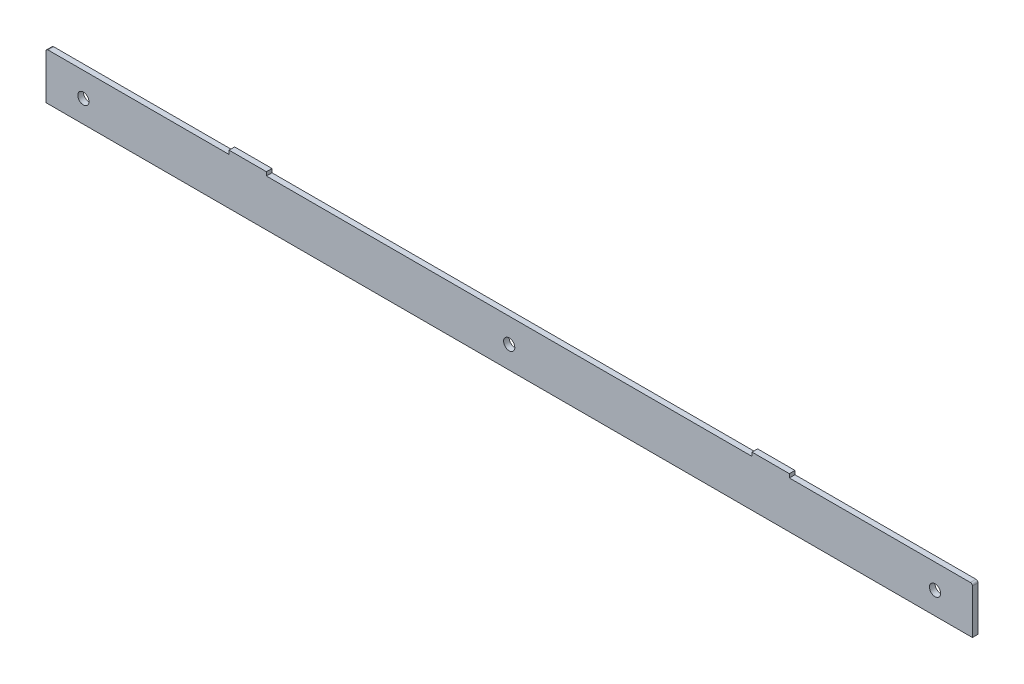
ISO-10303-21;
HEADER;
FILE_DESCRIPTION(('STEP AP214'),'2;1');
FILE_NAME('part.step','',(''),(''),'','','');
FILE_SCHEMA(('AUTOMOTIVE_DESIGN { 1 0 10303 214 1 1 1 1 }'));
ENDSEC;
DATA;
#1=APPLICATION_CONTEXT('core data for automotive mechanical design processes');
#2=APPLICATION_PROTOCOL_DEFINITION('international standard','automotive_design',2000,#1);
#3=PRODUCT_CONTEXT('',#1,'mechanical');
#4=PRODUCT('Part','Part','',(#3));
#5=PRODUCT_RELATED_PRODUCT_CATEGORY('part','',(#4));
#6=PRODUCT_DEFINITION_FORMATION('','',#4);
#7=PRODUCT_DEFINITION_CONTEXT('part definition',#1,'design');
#8=PRODUCT_DEFINITION('design','',#6,#7);
#9=PRODUCT_DEFINITION_SHAPE('','',#8);
#10=(LENGTH_UNIT() NAMED_UNIT(*) SI_UNIT(.MILLI.,.METRE.));
#11=(NAMED_UNIT(*) PLANE_ANGLE_UNIT() SI_UNIT($,.RADIAN.));
#12=(NAMED_UNIT(*) SI_UNIT($,.STERADIAN.) SOLID_ANGLE_UNIT());
#13=UNCERTAINTY_MEASURE_WITH_UNIT(LENGTH_MEASURE(1.E-05),#10,'distance_accuracy_value','');
#14=(GEOMETRIC_REPRESENTATION_CONTEXT(3) GLOBAL_UNCERTAINTY_ASSIGNED_CONTEXT((#13)) GLOBAL_UNIT_ASSIGNED_CONTEXT((#10,
#11,#12)) REPRESENTATION_CONTEXT('',''));
#15=CARTESIAN_POINT('',(0.,0.,0.));
#16=DIRECTION('',(0.,0.,1.));
#17=DIRECTION('',(1.,0.,0.));
#18=AXIS2_PLACEMENT_3D('',#15,#16,#17);
#19=CARTESIAN_POINT('',(-52.7153432272541,26.1805647840531,-3.));
#20=DIRECTION('',(0.,1.,0.));
#21=DIRECTION('',(0.,0.,1.));
#22=AXIS2_PLACEMENT_3D('',#19,#20,#21);
#23=PLANE('',#22);
#24=DIRECTION('',(-1.,0.,0.));
#25=VECTOR('',#24,1.);
#26=CARTESIAN_POINT('',(-52.7153432272541,26.1805647840531,0.));
#27=LINE('',#26,#25);
#28=CARTESIAN_POINT('',(324.184656772746,26.1805647840531,0.));
#29=VERTEX_POINT('',#28);
#30=CARTESIAN_POINT('',(64.1846567727459,26.1805647840531,0.));
#31=VERTEX_POINT('',#30);
#32=EDGE_CURVE('E218',#29,#31,#27,.T.);
#33=ORIENTED_EDGE('',*,*,#32,.F.);
#34=DIRECTION('',(0.,0.,1.));
#35=VECTOR('',#34,1.);
#36=CARTESIAN_POINT('',(324.184656772746,26.1805647840531,-3.00000000000006));
#37=LINE('',#36,#35);
#38=CARTESIAN_POINT('',(324.184656772746,26.1805647840531,-3.00000000000006));
#39=VERTEX_POINT('',#38);
#40=EDGE_CURVE('E52',#39,#29,#37,.T.);
#41=ORIENTED_EDGE('',*,*,#40,.F.);
#42=DIRECTION('',(-1.,0.,0.));
#43=VECTOR('',#42,1.);
#44=CARTESIAN_POINT('',(-52.7153432272541,26.1805647840531,-3.));
#45=LINE('',#44,#43);
#46=CARTESIAN_POINT('',(64.1846567727459,26.1805647840531,-3.00000000000002));
#47=VERTEX_POINT('',#46);
#48=EDGE_CURVE('E200',#39,#47,#45,.T.);
#49=ORIENTED_EDGE('',*,*,#48,.T.);
#50=DIRECTION('',(0.,0.,-1.));
#51=VECTOR('',#50,1.);
#52=CARTESIAN_POINT('',(64.1846567727459,26.1805647840531,-3.00000000000002));
#53=LINE('',#52,#51);
#54=EDGE_CURVE('E160',#31,#47,#53,.T.);
#55=ORIENTED_EDGE('',*,*,#54,.F.);
#56=EDGE_LOOP('',(#33,#41,#49,#55));
#57=FACE_BOUND('',#56,.T.);
#58=ADVANCED_FACE('F35',(#57),#23,.T.);
#59=CARTESIAN_POINT('',(441.084656772746,26.1805647840531,-3.));
#60=VERTEX_POINT('',#59);
#61=CARTESIAN_POINT('',(344.184656772746,26.1805647840531,-3.00000000000006));
#62=VERTEX_POINT('',#61);
#63=EDGE_CURVE('E196',#60,#62,#45,.T.);
#64=ORIENTED_EDGE('',*,*,#63,.T.);
#65=DIRECTION('',(0.,0.,-1.));
#66=VECTOR('',#65,1.);
#67=CARTESIAN_POINT('',(344.184656772746,26.1805647840531,-3.00000000000006));
#68=LINE('',#67,#66);
#69=CARTESIAN_POINT('',(344.184656772746,26.1805647840531,0.));
#70=VERTEX_POINT('',#69);
#71=EDGE_CURVE('E156',#70,#62,#68,.T.);
#72=ORIENTED_EDGE('',*,*,#71,.F.);
#73=CARTESIAN_POINT('',(441.084656772746,26.1805647840531,0.));
#74=VERTEX_POINT('',#73);
#75=EDGE_CURVE('E215',#74,#70,#27,.T.);
#76=ORIENTED_EDGE('',*,*,#75,.F.);
#77=DIRECTION('',(0.,0.,1.));
#78=VECTOR('',#77,1.);
#79=CARTESIAN_POINT('',(441.084656772746,26.1805647840531,-3.));
#80=LINE('',#79,#78);
#81=EDGE_CURVE('E232',#60,#74,#80,.T.);
#82=ORIENTED_EDGE('',*,*,#81,.F.);
#83=EDGE_LOOP('',(#64,#72,#76,#82));
#84=FACE_BOUND('',#83,.T.);
#85=ADVANCED_FACE('F268',(#84),#23,.T.);
#86=CARTESIAN_POINT('',(44.1846567727459,26.1805647840531,0.));
#87=VERTEX_POINT('',#86);
#88=CARTESIAN_POINT('',(-52.7153432272541,26.1805647840531,0.));
#89=VERTEX_POINT('',#88);
#90=EDGE_CURVE('E214',#87,#89,#27,.T.);
#91=ORIENTED_EDGE('',*,*,#90,.F.);
#92=DIRECTION('',(0.,0.,1.));
#93=VECTOR('',#92,1.);
#94=CARTESIAN_POINT('',(44.1846567727459,26.1805647840531,-3.00000000000002));
#95=LINE('',#94,#93);
#96=CARTESIAN_POINT('',(44.1846567727459,26.1805647840531,-3.00000000000002));
#97=VERTEX_POINT('',#96);
#98=EDGE_CURVE('E60',#97,#87,#95,.T.);
#99=ORIENTED_EDGE('',*,*,#98,.F.);
#100=CARTESIAN_POINT('',(-52.7153432272541,26.1805647840531,-3.));
#101=VERTEX_POINT('',#100);
#102=EDGE_CURVE('E195',#97,#101,#45,.T.);
#103=ORIENTED_EDGE('',*,*,#102,.T.);
#104=DIRECTION('',(0.,0.,1.));
#105=VECTOR('',#104,1.);
#106=CARTESIAN_POINT('',(-52.7153432272541,26.1805647840531,-3.));
#107=LINE('',#106,#105);
#108=EDGE_CURVE('E229',#101,#89,#107,.T.);
#109=ORIENTED_EDGE('',*,*,#108,.T.);
#110=EDGE_LOOP('',(#91,#99,#103,#109));
#111=FACE_BOUND('',#110,.T.);
#112=ADVANCED_FACE('F290',(#111),#23,.T.);
#113=CARTESIAN_POINT('',(442.184656772746,25.0805647840531,-3.));
#114=DIRECTION('',(1.,0.,0.));
#115=DIRECTION('',(0.,0.,-1.));
#116=AXIS2_PLACEMENT_3D('',#113,#114,#115);
#117=PLANE('',#116);
#118=DIRECTION('',(0.,1.,0.));
#119=VECTOR('',#118,1.);
#120=CARTESIAN_POINT('',(442.184656772746,25.0805647840531,0.));
#121=LINE('',#120,#119);
#122=CARTESIAN_POINT('',(442.184656772746,1.18056478405314,0.));
#123=VERTEX_POINT('',#122);
#124=CARTESIAN_POINT('',(442.184656772746,25.0805647840531,0.));
#125=VERTEX_POINT('',#124);
#126=EDGE_CURVE('E187',#123,#125,#121,.T.);
#127=ORIENTED_EDGE('',*,*,#126,.F.);
#128=DIRECTION('',(0.,0.,1.));
#129=VECTOR('',#128,1.);
#130=CARTESIAN_POINT('',(442.184656772746,1.18056478405314,-3.));
#131=LINE('',#130,#129);
#132=CARTESIAN_POINT('',(442.184656772746,1.18056478405314,-3.));
#133=VERTEX_POINT('',#132);
#134=EDGE_CURVE('E11',#133,#123,#131,.T.);
#135=ORIENTED_EDGE('',*,*,#134,.F.);
#136=DIRECTION('',(0.,1.,0.));
#137=VECTOR('',#136,1.);
#138=CARTESIAN_POINT('',(442.184656772746,25.0805647840531,-3.));
#139=LINE('',#138,#137);
#140=CARTESIAN_POINT('',(442.184656772746,25.0805647840531,-3.));
#141=VERTEX_POINT('',#140);
#142=EDGE_CURVE('E188',#133,#141,#139,.T.);
#143=ORIENTED_EDGE('',*,*,#142,.T.);
#144=DIRECTION('',(0.,0.,1.));
#145=VECTOR('',#144,1.);
#146=CARTESIAN_POINT('',(442.184656772746,25.0805647840531,-3.));
#147=LINE('',#146,#145);
#148=EDGE_CURVE('E209',#141,#125,#147,.T.);
#149=ORIENTED_EDGE('',*,*,#148,.T.);
#150=EDGE_LOOP('',(#127,#135,#143,#149));
#151=FACE_BOUND('',#150,.T.);
#152=ADVANCED_FACE('F37',(#151),#117,.T.);
#153=CARTESIAN_POINT('',(-53.8153432272541,1.18056478405314,-3.));
#154=DIRECTION('',(0.,-1.,0.));
#155=DIRECTION('',(0.,0.,-1.));
#156=AXIS2_PLACEMENT_3D('',#153,#154,#155);
#157=PLANE('',#156);
#158=DIRECTION('',(1.,0.,0.));
#159=VECTOR('',#158,1.);
#160=CARTESIAN_POINT('',(-53.8153432272541,1.18056478405314,0.));
#161=LINE('',#160,#159);
#162=CARTESIAN_POINT('',(-53.8153432272541,1.18056478405314,0.));
#163=VERTEX_POINT('',#162);
#164=EDGE_CURVE('E192',#163,#123,#161,.T.);
#165=ORIENTED_EDGE('',*,*,#164,.F.);
#166=DIRECTION('',(0.,0.,1.));
#167=VECTOR('',#166,1.);
#168=CARTESIAN_POINT('',(-53.8153432272541,1.18056478405314,-3.));
#169=LINE('',#168,#167);
#170=CARTESIAN_POINT('',(-53.8153432272541,1.18056478405314,-3.));
#171=VERTEX_POINT('',#170);
#172=EDGE_CURVE('E44',#171,#163,#169,.T.);
#173=ORIENTED_EDGE('',*,*,#172,.F.);
#174=DIRECTION('',(1.,0.,0.));
#175=VECTOR('',#174,1.);
#176=CARTESIAN_POINT('',(-53.8153432272541,1.18056478405314,-3.));
#177=LINE('',#176,#175);
#178=EDGE_CURVE('E206',#171,#133,#177,.T.);
#179=ORIENTED_EDGE('',*,*,#178,.T.);
#180=ORIENTED_EDGE('',*,*,#134,.T.);
#181=EDGE_LOOP('',(#165,#173,#179,#180));
#182=FACE_BOUND('',#181,.T.);
#183=ADVANCED_FACE('F278',(#182),#157,.T.);
#184=CARTESIAN_POINT('',(-53.8153432272541,25.0805647840531,-3.));
#185=DIRECTION('',(-1.,0.,0.));
#186=DIRECTION('',(0.,0.,1.));
#187=AXIS2_PLACEMENT_3D('',#184,#185,#186);
#188=PLANE('',#187);
#189=DIRECTION('',(0.,-1.,0.));
#190=VECTOR('',#189,1.);
#191=CARTESIAN_POINT('',(-53.8153432272541,25.0805647840531,0.));
#192=LINE('',#191,#190);
#193=CARTESIAN_POINT('',(-53.8153432272541,25.0805647840531,0.));
#194=VERTEX_POINT('',#193);
#195=EDGE_CURVE('E221',#194,#163,#192,.T.);
#196=ORIENTED_EDGE('',*,*,#195,.F.);
#197=DIRECTION('',(0.,0.,1.));
#198=VECTOR('',#197,1.);
#199=CARTESIAN_POINT('',(-53.8153432272541,25.0805647840531,-3.));
#200=LINE('',#199,#198);
#201=CARTESIAN_POINT('',(-53.8153432272541,25.0805647840531,-3.));
#202=VERTEX_POINT('',#201);
#203=EDGE_CURVE('E227',#202,#194,#200,.T.);
#204=ORIENTED_EDGE('',*,*,#203,.F.);
#205=DIRECTION('',(0.,-1.,0.));
#206=VECTOR('',#205,1.);
#207=CARTESIAN_POINT('',(-53.8153432272541,25.0805647840531,-3.));
#208=LINE('',#207,#206);
#209=EDGE_CURVE('E203',#202,#171,#208,.T.);
#210=ORIENTED_EDGE('',*,*,#209,.T.);
#211=ORIENTED_EDGE('',*,*,#172,.T.);
#212=EDGE_LOOP('',(#196,#204,#210,#211));
#213=FACE_BOUND('',#212,.T.);
#214=ADVANCED_FACE('F330',(#213),#188,.T.);
#215=CARTESIAN_POINT('',(-52.7153432272541,25.0805647840531,-3.));
#216=DIRECTION('',(0.,0.,1.));
#217=DIRECTION('',(1.,0.,0.));
#218=AXIS2_PLACEMENT_3D('',#215,#216,#217);
#219=CYLINDRICAL_SURFACE('',#218,1.1);
#220=CARTESIAN_POINT('',(-52.7153432272541,25.0805647840531,0.));
#221=DIRECTION('',(0.,0.,1.));
#222=DIRECTION('',(-1.,0.,0.));
#223=AXIS2_PLACEMENT_3D('',#220,#221,#222);
#224=CIRCLE('',#223,1.1);
#225=EDGE_CURVE('E217',#89,#194,#224,.T.);
#226=ORIENTED_EDGE('',*,*,#225,.F.);
#227=ORIENTED_EDGE('',*,*,#108,.F.);
#228=CARTESIAN_POINT('',(-52.7153432272541,25.0805647840531,-3.));
#229=DIRECTION('',(0.,0.,1.));
#230=DIRECTION('',(-1.,0.,0.));
#231=AXIS2_PLACEMENT_3D('',#228,#229,#230);
#232=CIRCLE('',#231,1.1);
#233=EDGE_CURVE('E199',#101,#202,#232,.T.);
#234=ORIENTED_EDGE('',*,*,#233,.T.);
#235=ORIENTED_EDGE('',*,*,#203,.T.);
#236=EDGE_LOOP('',(#226,#227,#234,#235));
#237=FACE_BOUND('',#236,.T.);
#238=ADVANCED_FACE('F286',(#237),#219,.T.);
#239=CARTESIAN_POINT('',(441.084656772746,25.0805647840531,-3.));
#240=DIRECTION('',(0.,0.,1.));
#241=DIRECTION('',(1.,0.,0.));
#242=AXIS2_PLACEMENT_3D('',#239,#240,#241);
#243=CYLINDRICAL_SURFACE('',#242,1.09999999999999);
#244=CARTESIAN_POINT('',(441.084656772746,25.0805647840531,0.));
#245=DIRECTION('',(0.,0.,1.));
#246=DIRECTION('',(1.,0.,0.));
#247=AXIS2_PLACEMENT_3D('',#244,#245,#246);
#248=CIRCLE('',#247,1.09999999999999);
#249=EDGE_CURVE('E211',#125,#74,#248,.T.);
#250=ORIENTED_EDGE('',*,*,#249,.F.);
#251=ORIENTED_EDGE('',*,*,#148,.F.);
#252=CARTESIAN_POINT('',(441.084656772746,25.0805647840531,-3.));
#253=DIRECTION('',(0.,0.,1.));
#254=DIRECTION('',(1.,0.,0.));
#255=AXIS2_PLACEMENT_3D('',#252,#253,#254);
#256=CIRCLE('',#255,1.09999999999999);
#257=EDGE_CURVE('E191',#141,#60,#256,.T.);
#258=ORIENTED_EDGE('',*,*,#257,.T.);
#259=ORIENTED_EDGE('',*,*,#81,.T.);
#260=EDGE_LOOP('',(#250,#251,#258,#259));
#261=FACE_BOUND('',#260,.T.);
#262=ADVANCED_FACE('F272',(#261),#243,.T.);
#263=CARTESIAN_POINT('',(-52.7153432272541,25.0805647840531,-3.));
#264=DIRECTION('',(0.,0.,-1.));
#265=DIRECTION('',(-1.,0.,0.));
#266=AXIS2_PLACEMENT_3D('',#263,#264,#265);
#267=PLANE('',#266);
#268=CARTESIAN_POINT('',(-33.8153432272541,13.1305647840531,-3.));
#269=DIRECTION('',(0.,0.,-1.));
#270=DIRECTION('',(-1.,0.,0.));
#271=AXIS2_PLACEMENT_3D('',#268,#269,#270);
#272=CIRCLE('',#271,3.);
#273=CARTESIAN_POINT('',(-36.8153432272541,13.1305647840531,-3.));
#274=VERTEX_POINT('',#273);
#275=EDGE_CURVE('E250',#274,#274,#272,.T.);
#276=ORIENTED_EDGE('',*,*,#275,.F.);
#277=EDGE_LOOP('',(#276));
#278=FACE_BOUND('',#277,.T.);
#279=CARTESIAN_POINT('',(194.184656772746,13.1305647840531,-3.));
#280=DIRECTION('',(0.,0.,-1.));
#281=DIRECTION('',(-1.,0.,0.));
#282=AXIS2_PLACEMENT_3D('',#279,#280,#281);
#283=CIRCLE('',#282,2.99999999999999);
#284=CARTESIAN_POINT('',(191.184656772746,13.1305647840531,-3.));
#285=VERTEX_POINT('',#284);
#286=EDGE_CURVE('E240',#285,#285,#283,.T.);
#287=ORIENTED_EDGE('',*,*,#286,.F.);
#288=EDGE_LOOP('',(#287));
#289=FACE_BOUND('',#288,.T.);
#290=CARTESIAN_POINT('',(422.184656772746,13.1305647840531,-3.));
#291=DIRECTION('',(0.,0.,-1.));
#292=DIRECTION('',(-1.,0.,0.));
#293=AXIS2_PLACEMENT_3D('',#290,#291,#292);
#294=CIRCLE('',#293,2.99999999999999);
#295=CARTESIAN_POINT('',(419.184656772746,13.1305647840531,-3.));
#296=VERTEX_POINT('',#295);
#297=EDGE_CURVE('E237',#296,#296,#294,.T.);
#298=ORIENTED_EDGE('',*,*,#297,.F.);
#299=EDGE_LOOP('',(#298));
#300=FACE_BOUND('',#299,.T.);
#301=ORIENTED_EDGE('',*,*,#142,.F.);
#302=ORIENTED_EDGE('',*,*,#178,.F.);
#303=ORIENTED_EDGE('',*,*,#209,.F.);
#304=ORIENTED_EDGE('',*,*,#233,.F.);
#305=ORIENTED_EDGE('',*,*,#102,.F.);
#306=DIRECTION('',(0.,-1.,0.));
#307=VECTOR('',#306,1.);
#308=CARTESIAN_POINT('',(44.1846567727459,28.1805647840531,-3.00000000000002));
#309=LINE('',#308,#307);
#310=CARTESIAN_POINT('',(44.1846567727459,28.1805647840531,-3.00000000000002));
#311=VERTEX_POINT('',#310);
#312=EDGE_CURVE('E174',#311,#97,#309,.T.);
#313=ORIENTED_EDGE('',*,*,#312,.F.);
#314=DIRECTION('',(-1.,0.,0.));
#315=VECTOR('',#314,1.);
#316=CARTESIAN_POINT('',(44.1846567727459,28.1805647840531,-3.00000000000002));
#317=LINE('',#316,#315);
#318=CARTESIAN_POINT('',(64.1846567727459,28.1805647840531,-3.00000000000002));
#319=VERTEX_POINT('',#318);
#320=EDGE_CURVE('E173',#319,#311,#317,.T.);
#321=ORIENTED_EDGE('',*,*,#320,.F.);
#322=DIRECTION('',(0.,-1.,0.));
#323=VECTOR('',#322,1.);
#324=CARTESIAN_POINT('',(64.1846567727459,28.1805647840531,-3.00000000000002));
#325=LINE('',#324,#323);
#326=EDGE_CURVE('E179',#319,#47,#325,.T.);
#327=ORIENTED_EDGE('',*,*,#326,.T.);
#328=ORIENTED_EDGE('',*,*,#48,.F.);
#329=DIRECTION('',(0.,-1.,0.));
#330=VECTOR('',#329,1.);
#331=CARTESIAN_POINT('',(324.184656772746,28.1805647840531,-3.00000000000006));
#332=LINE('',#331,#330);
#333=CARTESIAN_POINT('',(324.184656772746,28.1805647840531,-3.00000000000006));
#334=VERTEX_POINT('',#333);
#335=EDGE_CURVE('E255',#334,#39,#332,.T.);
#336=ORIENTED_EDGE('',*,*,#335,.F.);
#337=DIRECTION('',(-1.,0.,0.));
#338=VECTOR('',#337,1.);
#339=CARTESIAN_POINT('',(324.184656772746,28.1805647840531,-3.00000000000006));
#340=LINE('',#339,#338);
#341=CARTESIAN_POINT('',(344.184656772746,28.1805647840531,-3.00000000000006));
#342=VERTEX_POINT('',#341);
#343=EDGE_CURVE('E154',#342,#334,#340,.T.);
#344=ORIENTED_EDGE('',*,*,#343,.F.);
#345=DIRECTION('',(0.,-1.,0.));
#346=VECTOR('',#345,1.);
#347=CARTESIAN_POINT('',(344.184656772746,28.1805647840531,-3.00000000000006));
#348=LINE('',#347,#346);
#349=EDGE_CURVE('E162',#342,#62,#348,.T.);
#350=ORIENTED_EDGE('',*,*,#349,.T.);
#351=ORIENTED_EDGE('',*,*,#63,.F.);
#352=ORIENTED_EDGE('',*,*,#257,.F.);
#353=EDGE_LOOP('',(#301,#302,#303,#304,#305,#313,#321,#327,#328,#336,#344,#350,#351,#352));
#354=FACE_BOUND('',#353,.T.);
#355=ADVANCED_FACE('F263',(#278,#289,#300,#354),#267,.T.);
#356=CARTESIAN_POINT('',(-52.7153432272541,25.0805647840531,0.));
#357=DIRECTION('',(0.,0.,-1.));
#358=DIRECTION('',(-1.,0.,0.));
#359=AXIS2_PLACEMENT_3D('',#356,#357,#358);
#360=PLANE('',#359);
#361=CARTESIAN_POINT('',(-33.8153432272541,13.1305647840531,0.));
#362=DIRECTION('',(0.,0.,-1.));
#363=DIRECTION('',(-1.,0.,0.));
#364=AXIS2_PLACEMENT_3D('',#361,#362,#363);
#365=CIRCLE('',#364,3.);
#366=CARTESIAN_POINT('',(-36.8153432272541,13.1305647840531,0.));
#367=VERTEX_POINT('',#366);
#368=EDGE_CURVE('E39',#367,#367,#365,.T.);
#369=ORIENTED_EDGE('',*,*,#368,.T.);
#370=EDGE_LOOP('',(#369));
#371=FACE_BOUND('',#370,.T.);
#372=CARTESIAN_POINT('',(194.184656772746,13.1305647840531,0.));
#373=DIRECTION('',(0.,0.,-1.));
#374=DIRECTION('',(-1.,0.,0.));
#375=AXIS2_PLACEMENT_3D('',#372,#373,#374);
#376=CIRCLE('',#375,2.99999999999999);
#377=CARTESIAN_POINT('',(191.184656772746,13.1305647840531,0.));
#378=VERTEX_POINT('',#377);
#379=EDGE_CURVE('E238',#378,#378,#376,.T.);
#380=ORIENTED_EDGE('',*,*,#379,.T.);
#381=EDGE_LOOP('',(#380));
#382=FACE_BOUND('',#381,.T.);
#383=CARTESIAN_POINT('',(422.184656772746,13.1305647840531,0.));
#384=DIRECTION('',(0.,0.,-1.));
#385=DIRECTION('',(-1.,0.,0.));
#386=AXIS2_PLACEMENT_3D('',#383,#384,#385);
#387=CIRCLE('',#386,2.99999999999999);
#388=CARTESIAN_POINT('',(419.184656772746,13.1305647840531,0.));
#389=VERTEX_POINT('',#388);
#390=EDGE_CURVE('E235',#389,#389,#387,.T.);
#391=ORIENTED_EDGE('',*,*,#390,.T.);
#392=EDGE_LOOP('',(#391));
#393=FACE_BOUND('',#392,.T.);
#394=ORIENTED_EDGE('',*,*,#126,.T.);
#395=ORIENTED_EDGE('',*,*,#249,.T.);
#396=ORIENTED_EDGE('',*,*,#75,.T.);
#397=DIRECTION('',(0.,-1.,0.));
#398=VECTOR('',#397,1.);
#399=CARTESIAN_POINT('',(344.184656772746,28.1805647840531,0.));
#400=LINE('',#399,#398);
#401=CARTESIAN_POINT('',(344.184656772746,28.1805647840531,0.));
#402=VERTEX_POINT('',#401);
#403=EDGE_CURVE('E145',#402,#70,#400,.T.);
#404=ORIENTED_EDGE('',*,*,#403,.F.);
#405=DIRECTION('',(1.,0.,0.));
#406=VECTOR('',#405,1.);
#407=CARTESIAN_POINT('',(324.184656772746,28.1805647840531,0.));
#408=LINE('',#407,#406);
#409=CARTESIAN_POINT('',(324.184656772746,28.1805647840531,0.));
#410=VERTEX_POINT('',#409);
#411=EDGE_CURVE('E138',#410,#402,#408,.T.);
#412=ORIENTED_EDGE('',*,*,#411,.F.);
#413=DIRECTION('',(0.,-1.,0.));
#414=VECTOR('',#413,1.);
#415=CARTESIAN_POINT('',(324.184656772746,28.1805647840531,0.));
#416=LINE('',#415,#414);
#417=EDGE_CURVE('E142',#410,#29,#416,.T.);
#418=ORIENTED_EDGE('',*,*,#417,.T.);
#419=ORIENTED_EDGE('',*,*,#32,.T.);
#420=DIRECTION('',(0.,-1.,0.));
#421=VECTOR('',#420,1.);
#422=CARTESIAN_POINT('',(64.1846567727459,28.1805647840531,0.));
#423=LINE('',#422,#421);
#424=CARTESIAN_POINT('',(64.1846567727459,28.1805647840531,0.));
#425=VERTEX_POINT('',#424);
#426=EDGE_CURVE('E182',#425,#31,#423,.T.);
#427=ORIENTED_EDGE('',*,*,#426,.F.);
#428=DIRECTION('',(1.,0.,0.));
#429=VECTOR('',#428,1.);
#430=CARTESIAN_POINT('',(44.1846567727459,28.1805647840531,0.));
#431=LINE('',#430,#429);
#432=CARTESIAN_POINT('',(44.1846567727459,28.1805647840531,0.));
#433=VERTEX_POINT('',#432);
#434=EDGE_CURVE('E169',#433,#425,#431,.T.);
#435=ORIENTED_EDGE('',*,*,#434,.F.);
#436=DIRECTION('',(0.,-1.,0.));
#437=VECTOR('',#436,1.);
#438=CARTESIAN_POINT('',(44.1846567727459,28.1805647840531,0.));
#439=LINE('',#438,#437);
#440=EDGE_CURVE('E185',#433,#87,#439,.T.);
#441=ORIENTED_EDGE('',*,*,#440,.T.);
#442=ORIENTED_EDGE('',*,*,#90,.T.);
#443=ORIENTED_EDGE('',*,*,#225,.T.);
#444=ORIENTED_EDGE('',*,*,#195,.T.);
#445=ORIENTED_EDGE('',*,*,#164,.T.);
#446=EDGE_LOOP('',(#394,#395,#396,#404,#412,#418,#419,#427,#435,#441,#442,#443,#444,#445));
#447=FACE_BOUND('',#446,.T.);
#448=ADVANCED_FACE('F141',(#371,#382,#393,#447),#360,.F.);
#449=CARTESIAN_POINT('',(44.1846567727459,28.1805647840531,-3.00000000000002));
#450=DIRECTION('',(1.,0.,0.));
#451=DIRECTION('',(0.,0.,-1.));
#452=AXIS2_PLACEMENT_3D('',#449,#450,#451);
#453=PLANE('',#452);
#454=ORIENTED_EDGE('',*,*,#98,.T.);
#455=ORIENTED_EDGE('',*,*,#440,.F.);
#456=DIRECTION('',(0.,0.,1.));
#457=VECTOR('',#456,1.);
#458=CARTESIAN_POINT('',(44.1846567727459,28.1805647840531,-3.00000000000002));
#459=LINE('',#458,#457);
#460=EDGE_CURVE('E166',#311,#433,#459,.T.);
#461=ORIENTED_EDGE('',*,*,#460,.F.);
#462=ORIENTED_EDGE('',*,*,#312,.T.);
#463=EDGE_LOOP('',(#454,#455,#461,#462));
#464=FACE_BOUND('',#463,.T.);
#465=ADVANCED_FACE('F304',(#464),#453,.F.);
#466=CARTESIAN_POINT('',(64.1846567727459,28.1805647840531,-3.00000000000002));
#467=DIRECTION('',(-1.,0.,0.));
#468=DIRECTION('',(0.,0.,1.));
#469=AXIS2_PLACEMENT_3D('',#466,#467,#468);
#470=PLANE('',#469);
#471=ORIENTED_EDGE('',*,*,#54,.T.);
#472=ORIENTED_EDGE('',*,*,#326,.F.);
#473=DIRECTION('',(0.,0.,-1.));
#474=VECTOR('',#473,1.);
#475=CARTESIAN_POINT('',(64.1846567727459,28.1805647840531,-3.00000000000002));
#476=LINE('',#475,#474);
#477=EDGE_CURVE('E171',#425,#319,#476,.T.);
#478=ORIENTED_EDGE('',*,*,#477,.F.);
#479=ORIENTED_EDGE('',*,*,#426,.T.);
#480=EDGE_LOOP('',(#471,#472,#478,#479));
#481=FACE_BOUND('',#480,.T.);
#482=ADVANCED_FACE('F297',(#481),#470,.F.);
#483=CARTESIAN_POINT('',(0.,28.1805647840531,0.));
#484=DIRECTION('',(0.,1.,0.));
#485=DIRECTION('',(0.,0.,1.));
#486=AXIS2_PLACEMENT_3D('',#483,#484,#485);
#487=PLANE('',#486);
#488=ORIENTED_EDGE('',*,*,#460,.T.);
#489=ORIENTED_EDGE('',*,*,#434,.T.);
#490=ORIENTED_EDGE('',*,*,#477,.T.);
#491=ORIENTED_EDGE('',*,*,#320,.T.);
#492=EDGE_LOOP('',(#488,#489,#490,#491));
#493=FACE_BOUND('',#492,.T.);
#494=ADVANCED_FACE('F303',(#493),#487,.T.);
#495=CARTESIAN_POINT('',(324.184656772746,28.1805647840531,-3.00000000000006));
#496=DIRECTION('',(1.,0.,0.));
#497=DIRECTION('',(0.,0.,-1.));
#498=AXIS2_PLACEMENT_3D('',#495,#496,#497);
#499=PLANE('',#498);
#500=ORIENTED_EDGE('',*,*,#40,.T.);
#501=ORIENTED_EDGE('',*,*,#417,.F.);
#502=DIRECTION('',(0.,0.,1.));
#503=VECTOR('',#502,1.);
#504=CARTESIAN_POINT('',(324.184656772746,28.1805647840531,-3.00000000000006));
#505=LINE('',#504,#503);
#506=EDGE_CURVE('E149',#334,#410,#505,.T.);
#507=ORIENTED_EDGE('',*,*,#506,.F.);
#508=ORIENTED_EDGE('',*,*,#335,.T.);
#509=EDGE_LOOP('',(#500,#501,#507,#508));
#510=FACE_BOUND('',#509,.T.);
#511=ADVANCED_FACE('F158',(#510),#499,.F.);
#512=CARTESIAN_POINT('',(344.184656772746,28.1805647840531,-3.00000000000006));
#513=DIRECTION('',(-1.,0.,0.));
#514=DIRECTION('',(0.,0.,1.));
#515=AXIS2_PLACEMENT_3D('',#512,#513,#514);
#516=PLANE('',#515);
#517=ORIENTED_EDGE('',*,*,#71,.T.);
#518=ORIENTED_EDGE('',*,*,#349,.F.);
#519=DIRECTION('',(0.,0.,-1.));
#520=VECTOR('',#519,1.);
#521=CARTESIAN_POINT('',(344.184656772746,28.1805647840531,-3.00000000000006));
#522=LINE('',#521,#520);
#523=EDGE_CURVE('E148',#402,#342,#522,.T.);
#524=ORIENTED_EDGE('',*,*,#523,.F.);
#525=ORIENTED_EDGE('',*,*,#403,.T.);
#526=EDGE_LOOP('',(#517,#518,#524,#525));
#527=FACE_BOUND('',#526,.T.);
#528=ADVANCED_FACE('F366',(#527),#516,.F.);
#529=CARTESIAN_POINT('',(0.,28.1805647840531,0.));
#530=DIRECTION('',(0.,1.,0.));
#531=DIRECTION('',(0.,0.,1.));
#532=AXIS2_PLACEMENT_3D('',#529,#530,#531);
#533=PLANE('',#532);
#534=ORIENTED_EDGE('',*,*,#506,.T.);
#535=ORIENTED_EDGE('',*,*,#411,.T.);
#536=ORIENTED_EDGE('',*,*,#523,.T.);
#537=ORIENTED_EDGE('',*,*,#343,.T.);
#538=EDGE_LOOP('',(#534,#535,#536,#537));
#539=FACE_BOUND('',#538,.T.);
#540=ADVANCED_FACE('F152',(#539),#533,.T.);
#541=CARTESIAN_POINT('',(422.184656772746,13.1305647840531,7.));
#542=DIRECTION('',(0.,0.,-1.));
#543=DIRECTION('',(-1.,0.,0.));
#544=AXIS2_PLACEMENT_3D('',#541,#542,#543);
#545=CYLINDRICAL_SURFACE('',#544,2.99999999999999);
#546=ORIENTED_EDGE('',*,*,#297,.T.);
#547=EDGE_LOOP('',(#546));
#548=FACE_BOUND('',#547,.T.);
#549=ORIENTED_EDGE('',*,*,#390,.F.);
#550=EDGE_LOOP('',(#549));
#551=FACE_BOUND('',#550,.T.);
#552=ADVANCED_FACE('F353',(#548,#551),#545,.F.);
#553=CARTESIAN_POINT('',(194.184656772746,13.1305647840531,7.));
#554=DIRECTION('',(0.,0.,-1.));
#555=DIRECTION('',(-1.,0.,0.));
#556=AXIS2_PLACEMENT_3D('',#553,#554,#555);
#557=CYLINDRICAL_SURFACE('',#556,2.99999999999999);
#558=ORIENTED_EDGE('',*,*,#286,.T.);
#559=EDGE_LOOP('',(#558));
#560=FACE_BOUND('',#559,.T.);
#561=ORIENTED_EDGE('',*,*,#379,.F.);
#562=EDGE_LOOP('',(#561));
#563=FACE_BOUND('',#562,.T.);
#564=ADVANCED_FACE('F356',(#560,#563),#557,.F.);
#565=CARTESIAN_POINT('',(-33.8153432272541,13.1305647840531,7.));
#566=DIRECTION('',(0.,0.,-1.));
#567=DIRECTION('',(-1.,0.,0.));
#568=AXIS2_PLACEMENT_3D('',#565,#566,#567);
#569=CYLINDRICAL_SURFACE('',#568,3.);
#570=ORIENTED_EDGE('',*,*,#275,.T.);
#571=EDGE_LOOP('',(#570));
#572=FACE_BOUND('',#571,.T.);
#573=ORIENTED_EDGE('',*,*,#368,.F.);
#574=EDGE_LOOP('',(#573));
#575=FACE_BOUND('',#574,.T.);
#576=ADVANCED_FACE('F364',(#572,#575),#569,.F.);
#577=CLOSED_SHELL('',(#58,#85,#112,#152,#183,#214,#238,#262,#355,#448,#465,#482,#494,#511,#528,
#540,#552,#564,#576));
#578=MANIFOLD_SOLID_BREP('B2',#577);
#579=ADVANCED_BREP_SHAPE_REPRESENTATION('',(#18,#578),#14);
#580=SHAPE_DEFINITION_REPRESENTATION(#9,#579);
ENDSEC;
END-ISO-10303-21;
